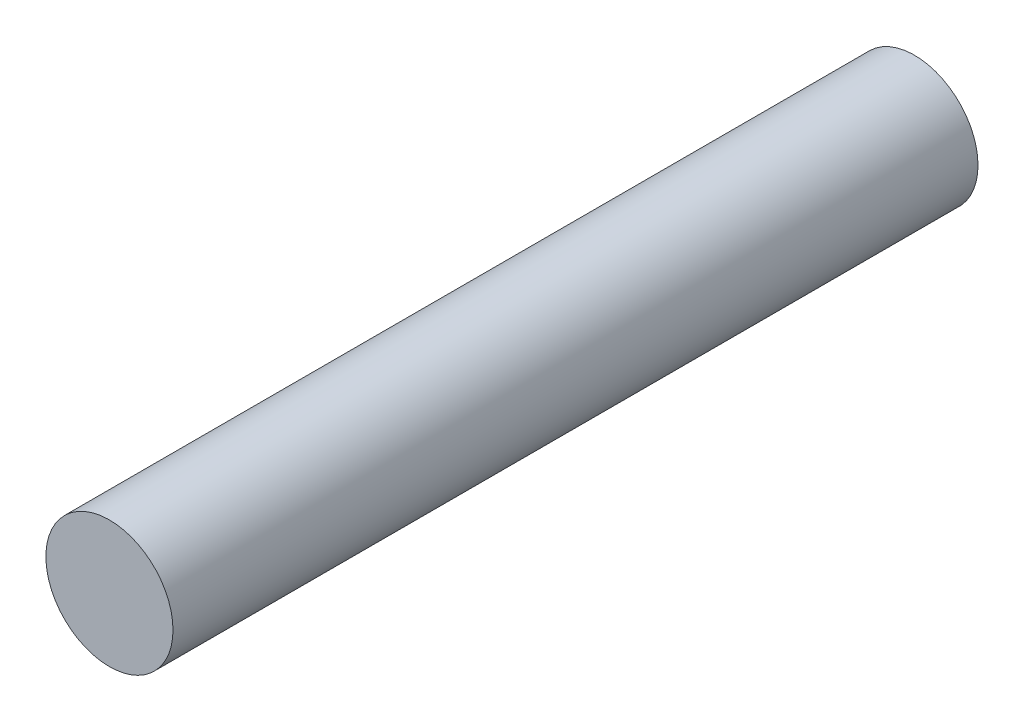
ISO-10303-21;
HEADER;
FILE_DESCRIPTION(('STEP AP214'),'2;1');
FILE_NAME('part.step','',(''),(''),'','','');
FILE_SCHEMA(('AUTOMOTIVE_DESIGN { 1 0 10303 214 1 1 1 1 }'));
ENDSEC;
DATA;
#1=APPLICATION_CONTEXT('core data for automotive mechanical design processes');
#2=APPLICATION_PROTOCOL_DEFINITION('international standard','automotive_design',2000,#1);
#3=PRODUCT_CONTEXT('',#1,'mechanical');
#4=PRODUCT('Part','Part','',(#3));
#5=PRODUCT_RELATED_PRODUCT_CATEGORY('part','',(#4));
#6=PRODUCT_DEFINITION_FORMATION('','',#4);
#7=PRODUCT_DEFINITION_CONTEXT('part definition',#1,'design');
#8=PRODUCT_DEFINITION('design','',#6,#7);
#9=PRODUCT_DEFINITION_SHAPE('','',#8);
#10=(LENGTH_UNIT() NAMED_UNIT(*) SI_UNIT(.MILLI.,.METRE.));
#11=(NAMED_UNIT(*) PLANE_ANGLE_UNIT() SI_UNIT($,.RADIAN.));
#12=(NAMED_UNIT(*) SI_UNIT($,.STERADIAN.) SOLID_ANGLE_UNIT());
#13=UNCERTAINTY_MEASURE_WITH_UNIT(LENGTH_MEASURE(1.E-05),#10,'distance_accuracy_value','');
#14=(GEOMETRIC_REPRESENTATION_CONTEXT(3) GLOBAL_UNCERTAINTY_ASSIGNED_CONTEXT((#13)) GLOBAL_UNIT_ASSIGNED_CONTEXT((#10,
#11,#12)) REPRESENTATION_CONTEXT('',''));
#15=CARTESIAN_POINT('',(0.,0.,0.));
#16=DIRECTION('',(0.,0.,1.));
#17=DIRECTION('',(1.,0.,0.));
#18=AXIS2_PLACEMENT_3D('',#15,#16,#17);
#19=CARTESIAN_POINT('',(0.,0.,380.));
#20=DIRECTION('',(0.,0.,-1.));
#21=DIRECTION('',(-1.,0.,0.));
#22=AXIS2_PLACEMENT_3D('',#19,#20,#21);
#23=CYLINDRICAL_SURFACE('',#22,30.);
#24=CARTESIAN_POINT('',(0.,0.,380.));
#25=DIRECTION('',(0.,0.,1.));
#26=DIRECTION('',(1.,0.,0.));
#27=AXIS2_PLACEMENT_3D('',#24,#25,#26);
#28=CIRCLE('',#27,30.);
#29=CARTESIAN_POINT('',(30.,0.,380.));
#30=VERTEX_POINT('',#29);
#31=EDGE_CURVE('E10',#30,#30,#28,.T.);
#32=ORIENTED_EDGE('',*,*,#31,.F.);
#33=EDGE_LOOP('',(#32));
#34=FACE_BOUND('',#33,.T.);
#35=CARTESIAN_POINT('',(0.,0.,0.));
#36=DIRECTION('',(0.,0.,1.));
#37=DIRECTION('',(1.,0.,0.));
#38=AXIS2_PLACEMENT_3D('',#35,#36,#37);
#39=CIRCLE('',#38,30.);
#40=CARTESIAN_POINT('',(30.,0.,0.));
#41=VERTEX_POINT('',#40);
#42=EDGE_CURVE('E42',#41,#41,#39,.T.);
#43=ORIENTED_EDGE('',*,*,#42,.T.);
#44=EDGE_LOOP('',(#43));
#45=FACE_BOUND('',#44,.T.);
#46=ADVANCED_FACE('F39',(#34,#45),#23,.T.);
#47=CARTESIAN_POINT('',(0.,0.,380.));
#48=DIRECTION('',(0.,0.,1.));
#49=DIRECTION('',(1.,0.,0.));
#50=AXIS2_PLACEMENT_3D('',#47,#48,#49);
#51=PLANE('',#50);
#52=ORIENTED_EDGE('',*,*,#31,.T.);
#53=EDGE_LOOP('',(#52));
#54=FACE_BOUND('',#53,.T.);
#55=ADVANCED_FACE('F54',(#54),#51,.T.);
#56=CARTESIAN_POINT('',(0.,0.,0.));
#57=DIRECTION('',(0.,0.,1.));
#58=DIRECTION('',(1.,0.,0.));
#59=AXIS2_PLACEMENT_3D('',#56,#57,#58);
#60=PLANE('',#59);
#61=ORIENTED_EDGE('',*,*,#42,.F.);
#62=EDGE_LOOP('',(#61));
#63=FACE_BOUND('',#62,.T.);
#64=ADVANCED_FACE('F52',(#63),#60,.F.);
#65=CLOSED_SHELL('',(#46,#55,#64));
#66=MANIFOLD_SOLID_BREP('B2',#65);
#67=ADVANCED_BREP_SHAPE_REPRESENTATION('',(#18,#66),#14);
#68=SHAPE_DEFINITION_REPRESENTATION(#9,#67);
ENDSEC;
END-ISO-10303-21;
